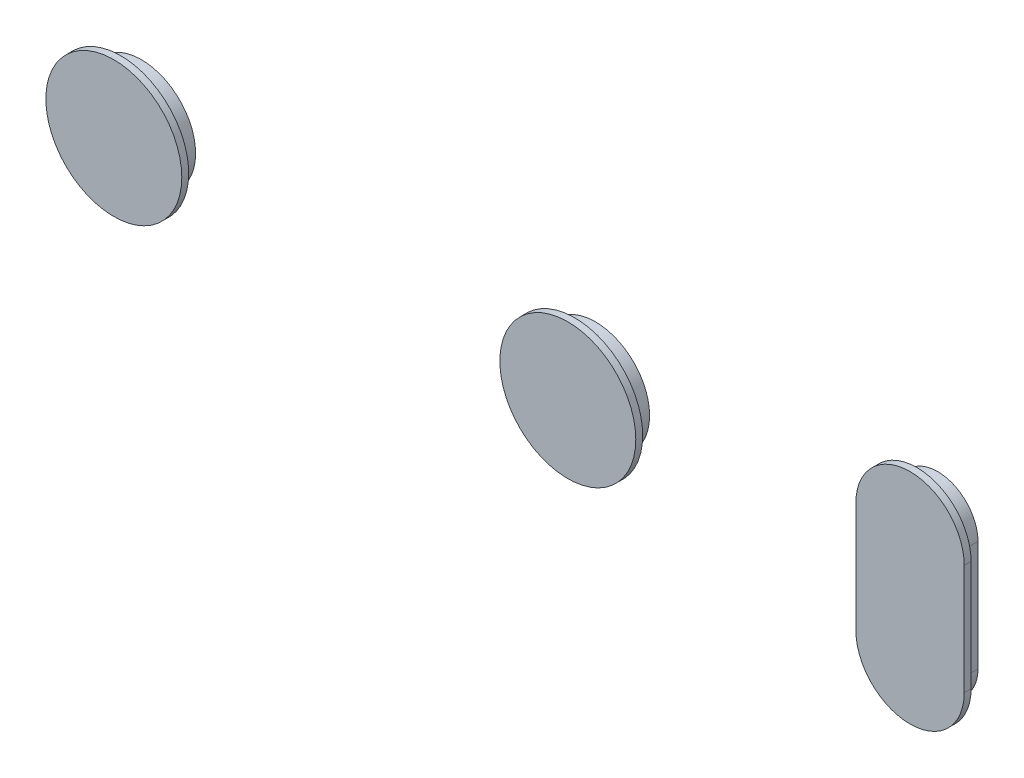
ISO-10303-21;
HEADER;
FILE_DESCRIPTION(('STEP AP214'),'2;1');
FILE_NAME('part.step','',(''),(''),'','','');
FILE_SCHEMA(('AUTOMOTIVE_DESIGN { 1 0 10303 214 1 1 1 1 }'));
ENDSEC;
DATA;
#1=APPLICATION_CONTEXT('core data for automotive mechanical design processes');
#2=APPLICATION_PROTOCOL_DEFINITION('international standard','automotive_design',2000,#1);
#3=PRODUCT_CONTEXT('',#1,'mechanical');
#4=PRODUCT('Part','Part','',(#3));
#5=PRODUCT_RELATED_PRODUCT_CATEGORY('part','',(#4));
#6=PRODUCT_DEFINITION_FORMATION('','',#4);
#7=PRODUCT_DEFINITION_CONTEXT('part definition',#1,'design');
#8=PRODUCT_DEFINITION('design','',#6,#7);
#9=PRODUCT_DEFINITION_SHAPE('','',#8);
#10=(LENGTH_UNIT() NAMED_UNIT(*) SI_UNIT(.MILLI.,.METRE.));
#11=(NAMED_UNIT(*) PLANE_ANGLE_UNIT() SI_UNIT($,.RADIAN.));
#12=(NAMED_UNIT(*) SI_UNIT($,.STERADIAN.) SOLID_ANGLE_UNIT());
#13=UNCERTAINTY_MEASURE_WITH_UNIT(LENGTH_MEASURE(1.E-05),#10,'distance_accuracy_value','');
#14=(GEOMETRIC_REPRESENTATION_CONTEXT(3) GLOBAL_UNCERTAINTY_ASSIGNED_CONTEXT((#13)) GLOBAL_UNIT_ASSIGNED_CONTEXT((#10,
#11,#12)) REPRESENTATION_CONTEXT('',''));
#15=CARTESIAN_POINT('',(0.,0.,0.));
#16=DIRECTION('',(0.,0.,1.));
#17=DIRECTION('',(1.,0.,0.));
#18=AXIS2_PLACEMENT_3D('',#15,#16,#17);
#19=CARTESIAN_POINT('',(313.691338582678,297.752755905512,-33.0695859632289));
#20=DIRECTION('',(0.,0.,1.));
#21=DIRECTION('',(1.,0.,0.));
#22=AXIS2_PLACEMENT_3D('',#19,#20,#21);
#23=CYLINDRICAL_SURFACE('',#22,5.85000000000002);
#24=CARTESIAN_POINT('',(313.691338582678,297.752755905512,-3.));
#25=DIRECTION('',(0.,0.,1.));
#26=DIRECTION('',(1.,0.,0.));
#27=AXIS2_PLACEMENT_3D('',#24,#25,#26);
#28=CIRCLE('',#27,5.85000000000002);
#29=CARTESIAN_POINT('',(307.841338582678,297.752755905512,-3.));
#30=VERTEX_POINT('',#29);
#31=CARTESIAN_POINT('',(319.541338582678,297.752755905512,-3.));
#32=VERTEX_POINT('',#31);
#33=EDGE_CURVE('E54',#30,#32,#28,.F.);
#34=ORIENTED_EDGE('',*,*,#33,.F.);
#35=DIRECTION('',(0.,0.,1.));
#36=VECTOR('',#35,1.);
#37=CARTESIAN_POINT('',(307.841338582678,297.752755905512,-33.0695859632289));
#38=LINE('',#37,#36);
#39=CARTESIAN_POINT('',(307.841338582678,297.752755905512,0.));
#40=VERTEX_POINT('',#39);
#41=EDGE_CURVE('E152',#30,#40,#38,.T.);
#42=ORIENTED_EDGE('',*,*,#41,.T.);
#43=CARTESIAN_POINT('',(313.691338582678,297.752755905512,0.));
#44=DIRECTION('',(0.,0.,1.));
#45=DIRECTION('',(1.,0.,0.));
#46=AXIS2_PLACEMENT_3D('',#43,#44,#45);
#47=CIRCLE('',#46,5.85000000000002);
#48=CARTESIAN_POINT('',(319.541338582678,297.752755905512,0.));
#49=VERTEX_POINT('',#48);
#50=EDGE_CURVE('E130',#49,#40,#47,.T.);
#51=ORIENTED_EDGE('',*,*,#50,.F.);
#52=DIRECTION('',(0.,0.,1.));
#53=VECTOR('',#52,1.);
#54=CARTESIAN_POINT('',(319.541338582678,297.752755905512,-33.0695859632289));
#55=LINE('',#54,#53);
#56=EDGE_CURVE('E141',#32,#49,#55,.T.);
#57=ORIENTED_EDGE('',*,*,#56,.F.);
#58=EDGE_LOOP('',(#34,#42,#51,#57));
#59=FACE_BOUND('',#58,.T.);
#60=ADVANCED_FACE('F46',(#59),#23,.T.);
#61=CARTESIAN_POINT('',(319.541338582677,281.752755905512,-33.0695859632289));
#62=DIRECTION('',(1.,0.,0.));
#63=DIRECTION('',(0.,1.,0.));
#64=AXIS2_PLACEMENT_3D('',#61,#62,#63);
#65=PLANE('',#64);
#66=DIRECTION('',(0.,-1.,0.));
#67=VECTOR('',#66,1.);
#68=CARTESIAN_POINT('',(319.541338582677,281.752755905512,-3.));
#69=LINE('',#68,#67);
#70=CARTESIAN_POINT('',(319.541338582677,281.752755905512,-3.));
#71=VERTEX_POINT('',#70);
#72=EDGE_CURVE('E60',#32,#71,#69,.T.);
#73=ORIENTED_EDGE('',*,*,#72,.F.);
#74=ORIENTED_EDGE('',*,*,#56,.T.);
#75=DIRECTION('',(0.,1.,0.));
#76=VECTOR('',#75,1.);
#77=CARTESIAN_POINT('',(319.541338582677,281.752755905512,0.));
#78=LINE('',#77,#76);
#79=CARTESIAN_POINT('',(319.541338582677,281.752755905512,0.));
#80=VERTEX_POINT('',#79);
#81=EDGE_CURVE('E149',#80,#49,#78,.T.);
#82=ORIENTED_EDGE('',*,*,#81,.F.);
#83=DIRECTION('',(0.,0.,1.));
#84=VECTOR('',#83,1.);
#85=CARTESIAN_POINT('',(319.541338582677,281.752755905512,-33.0695859632289));
#86=LINE('',#85,#84);
#87=EDGE_CURVE('E155',#71,#80,#86,.T.);
#88=ORIENTED_EDGE('',*,*,#87,.F.);
#89=EDGE_LOOP('',(#73,#74,#82,#88));
#90=FACE_BOUND('',#89,.T.);
#91=ADVANCED_FACE('F173',(#90),#65,.T.);
#92=CARTESIAN_POINT('',(313.691338582677,281.752755905512,-33.0695859632289));
#93=DIRECTION('',(0.,0.,1.));
#94=DIRECTION('',(1.,0.,0.));
#95=AXIS2_PLACEMENT_3D('',#92,#93,#94);
#96=CYLINDRICAL_SURFACE('',#95,5.85000000000002);
#97=CARTESIAN_POINT('',(313.691338582677,281.752755905512,-3.));
#98=DIRECTION('',(0.,0.,1.));
#99=DIRECTION('',(1.,0.,0.));
#100=AXIS2_PLACEMENT_3D('',#97,#98,#99);
#101=CIRCLE('',#100,5.85000000000002);
#102=CARTESIAN_POINT('',(307.841338582677,281.752755905512,-3.));
#103=VERTEX_POINT('',#102);
#104=EDGE_CURVE('E139',#71,#103,#101,.F.);
#105=ORIENTED_EDGE('',*,*,#104,.F.);
#106=ORIENTED_EDGE('',*,*,#87,.T.);
#107=CARTESIAN_POINT('',(313.691338582677,281.752755905512,0.));
#108=DIRECTION('',(0.,0.,1.));
#109=DIRECTION('',(1.,0.,0.));
#110=AXIS2_PLACEMENT_3D('',#107,#108,#109);
#111=CIRCLE('',#110,5.85000000000002);
#112=CARTESIAN_POINT('',(307.841338582677,281.752755905512,0.));
#113=VERTEX_POINT('',#112);
#114=EDGE_CURVE('E146',#113,#80,#111,.T.);
#115=ORIENTED_EDGE('',*,*,#114,.F.);
#116=DIRECTION('',(0.,0.,1.));
#117=VECTOR('',#116,1.);
#118=CARTESIAN_POINT('',(307.841338582677,281.752755905512,-33.0695859632289));
#119=LINE('',#118,#117);
#120=EDGE_CURVE('E157',#103,#113,#119,.T.);
#121=ORIENTED_EDGE('',*,*,#120,.F.);
#122=EDGE_LOOP('',(#105,#106,#115,#121));
#123=FACE_BOUND('',#122,.T.);
#124=ADVANCED_FACE('F175',(#123),#96,.T.);
#125=CARTESIAN_POINT('',(307.841338582678,297.752755905512,-33.0695859632289));
#126=DIRECTION('',(-1.,0.,0.));
#127=DIRECTION('',(0.,-1.,0.));
#128=AXIS2_PLACEMENT_3D('',#125,#126,#127);
#129=PLANE('',#128);
#130=DIRECTION('',(0.,1.,0.));
#131=VECTOR('',#130,1.);
#132=CARTESIAN_POINT('',(307.841338582678,297.752755905512,-3.));
#133=LINE('',#132,#131);
#134=EDGE_CURVE('E12',#103,#30,#133,.T.);
#135=ORIENTED_EDGE('',*,*,#134,.F.);
#136=ORIENTED_EDGE('',*,*,#120,.T.);
#137=DIRECTION('',(0.,-1.,0.));
#138=VECTOR('',#137,1.);
#139=CARTESIAN_POINT('',(307.841338582678,297.752755905512,0.));
#140=LINE('',#139,#138);
#141=EDGE_CURVE('E133',#40,#113,#140,.T.);
#142=ORIENTED_EDGE('',*,*,#141,.F.);
#143=ORIENTED_EDGE('',*,*,#41,.F.);
#144=EDGE_LOOP('',(#135,#136,#142,#143));
#145=FACE_BOUND('',#144,.T.);
#146=ADVANCED_FACE('F165',(#145),#129,.T.);
#147=CARTESIAN_POINT('',(43.6913385826773,289.752755905512,-3.));
#148=DIRECTION('',(0.,0.,1.));
#149=DIRECTION('',(1.,0.,0.));
#150=AXIS2_PLACEMENT_3D('',#147,#148,#149);
#151=PLANE('',#150);
#152=ORIENTED_EDGE('',*,*,#33,.T.);
#153=ORIENTED_EDGE('',*,*,#72,.T.);
#154=ORIENTED_EDGE('',*,*,#104,.T.);
#155=ORIENTED_EDGE('',*,*,#134,.T.);
#156=EDGE_LOOP('',(#152,#153,#154,#155));
#157=FACE_BOUND('',#156,.T.);
#158=ADVANCED_FACE('F176',(#157),#151,.F.);
#159=CARTESIAN_POINT('',(313.691338582678,297.752755905512,0.));
#160=DIRECTION('',(0.,0.,1.));
#161=DIRECTION('',(1.,0.,0.));
#162=AXIS2_PLACEMENT_3D('',#159,#160,#161);
#163=PLANE('',#162);
#164=CARTESIAN_POINT('',(313.691338582678,297.752755905512,0.));
#165=DIRECTION('',(0.,0.,1.));
#166=DIRECTION('',(1.,0.,0.));
#167=AXIS2_PLACEMENT_3D('',#164,#165,#166);
#168=CIRCLE('',#167,7.85000000000002);
#169=CARTESIAN_POINT('',(321.541338582678,297.752755905512,0.));
#170=VERTEX_POINT('',#169);
#171=CARTESIAN_POINT('',(305.841338582678,297.752755905512,0.));
#172=VERTEX_POINT('',#171);
#173=EDGE_CURVE('E129',#170,#172,#168,.T.);
#174=ORIENTED_EDGE('',*,*,#173,.F.);
#175=DIRECTION('',(0.,1.,0.));
#176=VECTOR('',#175,1.);
#177=CARTESIAN_POINT('',(321.541338582677,281.752755905512,0.));
#178=LINE('',#177,#176);
#179=CARTESIAN_POINT('',(321.541338582677,281.752755905512,0.));
#180=VERTEX_POINT('',#179);
#181=EDGE_CURVE('E125',#180,#170,#178,.T.);
#182=ORIENTED_EDGE('',*,*,#181,.F.);
#183=CARTESIAN_POINT('',(313.691338582677,281.752755905512,0.));
#184=DIRECTION('',(0.,0.,1.));
#185=DIRECTION('',(1.,0.,0.));
#186=AXIS2_PLACEMENT_3D('',#183,#184,#185);
#187=CIRCLE('',#186,7.85000000000002);
#188=CARTESIAN_POINT('',(305.841338582677,281.752755905512,0.));
#189=VERTEX_POINT('',#188);
#190=EDGE_CURVE('E260',#189,#180,#187,.T.);
#191=ORIENTED_EDGE('',*,*,#190,.F.);
#192=DIRECTION('',(0.,-1.,0.));
#193=VECTOR('',#192,1.);
#194=CARTESIAN_POINT('',(305.841338582678,297.752755905512,0.));
#195=LINE('',#194,#193);
#196=EDGE_CURVE('E263',#172,#189,#195,.T.);
#197=ORIENTED_EDGE('',*,*,#196,.F.);
#198=EDGE_LOOP('',(#174,#182,#191,#197));
#199=FACE_BOUND('',#198,.T.);
#200=ORIENTED_EDGE('',*,*,#81,.T.);
#201=ORIENTED_EDGE('',*,*,#50,.T.);
#202=ORIENTED_EDGE('',*,*,#141,.T.);
#203=ORIENTED_EDGE('',*,*,#114,.T.);
#204=EDGE_LOOP('',(#200,#201,#202,#203));
#205=FACE_BOUND('',#204,.T.);
#206=ADVANCED_FACE('F169',(#199,#205),#163,.F.);
#207=CARTESIAN_POINT('',(313.691338582678,297.752755905512,1.));
#208=DIRECTION('',(0.,0.,-1.));
#209=DIRECTION('',(-1.,0.,0.));
#210=AXIS2_PLACEMENT_3D('',#207,#208,#209);
#211=CYLINDRICAL_SURFACE('',#210,7.85000000000002);
#212=ORIENTED_EDGE('',*,*,#173,.T.);
#213=DIRECTION('',(0.,0.,-1.));
#214=VECTOR('',#213,1.);
#215=CARTESIAN_POINT('',(305.841338582678,297.752755905512,1.));
#216=LINE('',#215,#214);
#217=CARTESIAN_POINT('',(305.841338582678,297.752755905512,1.));
#218=VERTEX_POINT('',#217);
#219=EDGE_CURVE('E109',#218,#172,#216,.T.);
#220=ORIENTED_EDGE('',*,*,#219,.F.);
#221=CARTESIAN_POINT('',(313.691338582678,297.752755905512,1.));
#222=DIRECTION('',(0.,0.,1.));
#223=DIRECTION('',(1.,0.,0.));
#224=AXIS2_PLACEMENT_3D('',#221,#222,#223);
#225=CIRCLE('',#224,7.85000000000002);
#226=CARTESIAN_POINT('',(321.541338582678,297.752755905512,1.));
#227=VERTEX_POINT('',#226);
#228=EDGE_CURVE('E116',#227,#218,#225,.T.);
#229=ORIENTED_EDGE('',*,*,#228,.F.);
#230=DIRECTION('',(0.,0.,-1.));
#231=VECTOR('',#230,1.);
#232=CARTESIAN_POINT('',(321.541338582678,297.752755905512,1.));
#233=LINE('',#232,#231);
#234=EDGE_CURVE('E257',#227,#170,#233,.T.);
#235=ORIENTED_EDGE('',*,*,#234,.T.);
#236=EDGE_LOOP('',(#212,#220,#229,#235));
#237=FACE_BOUND('',#236,.T.);
#238=ADVANCED_FACE('F127',(#237),#211,.T.);
#239=CARTESIAN_POINT('',(305.841338582678,297.752755905512,1.));
#240=DIRECTION('',(1.,0.,0.));
#241=DIRECTION('',(0.,1.,0.));
#242=AXIS2_PLACEMENT_3D('',#239,#240,#241);
#243=PLANE('',#242);
#244=ORIENTED_EDGE('',*,*,#196,.T.);
#245=DIRECTION('',(0.,0.,-1.));
#246=VECTOR('',#245,1.);
#247=CARTESIAN_POINT('',(305.841338582677,281.752755905512,1.));
#248=LINE('',#247,#246);
#249=CARTESIAN_POINT('',(305.841338582677,281.752755905512,1.));
#250=VERTEX_POINT('',#249);
#251=EDGE_CURVE('E112',#250,#189,#248,.T.);
#252=ORIENTED_EDGE('',*,*,#251,.F.);
#253=DIRECTION('',(0.,-1.,0.));
#254=VECTOR('',#253,1.);
#255=CARTESIAN_POINT('',(305.841338582678,297.752755905512,1.));
#256=LINE('',#255,#254);
#257=EDGE_CURVE('E105',#218,#250,#256,.T.);
#258=ORIENTED_EDGE('',*,*,#257,.F.);
#259=ORIENTED_EDGE('',*,*,#219,.T.);
#260=EDGE_LOOP('',(#244,#252,#258,#259));
#261=FACE_BOUND('',#260,.T.);
#262=ADVANCED_FACE('F107',(#261),#243,.F.);
#263=CARTESIAN_POINT('',(313.691338582677,281.752755905512,1.));
#264=DIRECTION('',(0.,0.,-1.));
#265=DIRECTION('',(-1.,0.,0.));
#266=AXIS2_PLACEMENT_3D('',#263,#264,#265);
#267=CYLINDRICAL_SURFACE('',#266,7.85000000000002);
#268=ORIENTED_EDGE('',*,*,#190,.T.);
#269=DIRECTION('',(0.,0.,-1.));
#270=VECTOR('',#269,1.);
#271=CARTESIAN_POINT('',(321.541338582677,281.752755905512,1.));
#272=LINE('',#271,#270);
#273=CARTESIAN_POINT('',(321.541338582677,281.752755905512,1.));
#274=VERTEX_POINT('',#273);
#275=EDGE_CURVE('E135',#274,#180,#272,.T.);
#276=ORIENTED_EDGE('',*,*,#275,.F.);
#277=CARTESIAN_POINT('',(313.691338582677,281.752755905512,1.));
#278=DIRECTION('',(0.,0.,1.));
#279=DIRECTION('',(1.,0.,0.));
#280=AXIS2_PLACEMENT_3D('',#277,#278,#279);
#281=CIRCLE('',#280,7.85000000000002);
#282=EDGE_CURVE('E115',#250,#274,#281,.T.);
#283=ORIENTED_EDGE('',*,*,#282,.F.);
#284=ORIENTED_EDGE('',*,*,#251,.T.);
#285=EDGE_LOOP('',(#268,#276,#283,#284));
#286=FACE_BOUND('',#285,.T.);
#287=ADVANCED_FACE('F224',(#286),#267,.T.);
#288=CARTESIAN_POINT('',(321.541338582677,281.752755905512,1.));
#289=DIRECTION('',(-1.,0.,0.));
#290=DIRECTION('',(0.,-1.,0.));
#291=AXIS2_PLACEMENT_3D('',#288,#289,#290);
#292=PLANE('',#291);
#293=ORIENTED_EDGE('',*,*,#181,.T.);
#294=ORIENTED_EDGE('',*,*,#234,.F.);
#295=DIRECTION('',(0.,1.,0.));
#296=VECTOR('',#295,1.);
#297=CARTESIAN_POINT('',(321.541338582677,281.752755905512,1.));
#298=LINE('',#297,#296);
#299=EDGE_CURVE('E121',#274,#227,#298,.T.);
#300=ORIENTED_EDGE('',*,*,#299,.F.);
#301=ORIENTED_EDGE('',*,*,#275,.T.);
#302=EDGE_LOOP('',(#293,#294,#300,#301));
#303=FACE_BOUND('',#302,.T.);
#304=ADVANCED_FACE('F233',(#303),#292,.F.);
#305=CARTESIAN_POINT('',(313.691338582678,297.752755905512,1.));
#306=DIRECTION('',(0.,0.,1.));
#307=DIRECTION('',(1.,0.,0.));
#308=AXIS2_PLACEMENT_3D('',#305,#306,#307);
#309=PLANE('',#308);
#310=ORIENTED_EDGE('',*,*,#228,.T.);
#311=ORIENTED_EDGE('',*,*,#257,.T.);
#312=ORIENTED_EDGE('',*,*,#282,.T.);
#313=ORIENTED_EDGE('',*,*,#299,.T.);
#314=EDGE_LOOP('',(#310,#311,#312,#313));
#315=FACE_BOUND('',#314,.T.);
#316=ADVANCED_FACE('F119',(#315),#309,.T.);
#317=CLOSED_SHELL('',(#60,#91,#124,#146,#158,#206,#238,#262,#287,#304,#316));
#318=MANIFOLD_SOLID_BREP('B2',#317);
#319=CARTESIAN_POINT('',(264.091338582678,289.752755905512,-33.0695859632289));
#320=DIRECTION('',(0.,0.,1.));
#321=DIRECTION('',(1.,0.,0.));
#322=AXIS2_PLACEMENT_3D('',#319,#320,#321);
#323=CYLINDRICAL_SURFACE('',#322,7.84999999999997);
#324=CARTESIAN_POINT('',(264.091338582678,289.752755905512,-3.));
#325=DIRECTION('',(0.,0.,1.));
#326=DIRECTION('',(1.,0.,0.));
#327=AXIS2_PLACEMENT_3D('',#324,#325,#326);
#328=CIRCLE('',#327,7.84999999999997);
#329=CARTESIAN_POINT('',(271.941338582677,289.752755905512,-3.));
#330=VERTEX_POINT('',#329);
#331=EDGE_CURVE('E45',#330,#330,#328,.F.);
#332=ORIENTED_EDGE('',*,*,#331,.F.);
#333=EDGE_LOOP('',(#332));
#334=FACE_BOUND('',#333,.T.);
#335=CARTESIAN_POINT('',(264.091338582678,289.752755905512,0.));
#336=DIRECTION('',(0.,0.,1.));
#337=DIRECTION('',(1.,0.,0.));
#338=AXIS2_PLACEMENT_3D('',#335,#336,#337);
#339=CIRCLE('',#338,7.84999999999997);
#340=CARTESIAN_POINT('',(271.941338582677,289.752755905512,0.));
#341=VERTEX_POINT('',#340);
#342=EDGE_CURVE('E299',#341,#341,#339,.T.);
#343=ORIENTED_EDGE('',*,*,#342,.F.);
#344=EDGE_LOOP('',(#343));
#345=FACE_BOUND('',#344,.T.);
#346=ADVANCED_FACE('F292',(#334,#345),#323,.T.);
#347=CARTESIAN_POINT('',(43.6913385826773,289.752755905512,-3.));
#348=DIRECTION('',(0.,0.,1.));
#349=DIRECTION('',(1.,0.,0.));
#350=AXIS2_PLACEMENT_3D('',#347,#348,#349);
#351=PLANE('',#350);
#352=ORIENTED_EDGE('',*,*,#331,.T.);
#353=EDGE_LOOP('',(#352));
#354=FACE_BOUND('',#353,.T.);
#355=ADVANCED_FACE('F329',(#354),#351,.F.);
#356=CARTESIAN_POINT('',(264.091338582678,289.752755905512,1.));
#357=DIRECTION('',(0.,0.,-1.));
#358=DIRECTION('',(-1.,0.,0.));
#359=AXIS2_PLACEMENT_3D('',#356,#357,#358);
#360=CYLINDRICAL_SURFACE('',#359,9.84999999999996);
#361=CARTESIAN_POINT('',(264.091338582678,289.752755905512,1.));
#362=DIRECTION('',(0.,0.,1.));
#363=DIRECTION('',(1.,0.,0.));
#364=AXIS2_PLACEMENT_3D('',#361,#362,#363);
#365=CIRCLE('',#364,9.84999999999996);
#366=CARTESIAN_POINT('',(273.941338582677,289.752755905512,1.));
#367=VERTEX_POINT('',#366);
#368=EDGE_CURVE('E305',#367,#367,#365,.T.);
#369=ORIENTED_EDGE('',*,*,#368,.F.);
#370=EDGE_LOOP('',(#369));
#371=FACE_BOUND('',#370,.T.);
#372=CARTESIAN_POINT('',(264.091338582678,289.752755905512,0.));
#373=DIRECTION('',(0.,0.,1.));
#374=DIRECTION('',(1.,0.,0.));
#375=AXIS2_PLACEMENT_3D('',#372,#373,#374);
#376=CIRCLE('',#375,9.84999999999996);
#377=CARTESIAN_POINT('',(273.941338582677,289.752755905512,0.));
#378=VERTEX_POINT('',#377);
#379=EDGE_CURVE('E310',#378,#378,#376,.T.);
#380=ORIENTED_EDGE('',*,*,#379,.T.);
#381=EDGE_LOOP('',(#380));
#382=FACE_BOUND('',#381,.T.);
#383=ADVANCED_FACE('F316',(#371,#382),#360,.T.);
#384=CARTESIAN_POINT('',(264.091338582678,289.752755905512,1.));
#385=DIRECTION('',(0.,0.,1.));
#386=DIRECTION('',(1.,0.,0.));
#387=AXIS2_PLACEMENT_3D('',#384,#385,#386);
#388=PLANE('',#387);
#389=ORIENTED_EDGE('',*,*,#368,.T.);
#390=EDGE_LOOP('',(#389));
#391=FACE_BOUND('',#390,.T.);
#392=ADVANCED_FACE('F320',(#391),#388,.T.);
#393=CARTESIAN_POINT('',(264.091338582678,289.752755905512,0.));
#394=DIRECTION('',(0.,0.,1.));
#395=DIRECTION('',(1.,0.,0.));
#396=AXIS2_PLACEMENT_3D('',#393,#394,#395);
#397=PLANE('',#396);
#398=ORIENTED_EDGE('',*,*,#342,.T.);
#399=EDGE_LOOP('',(#398));
#400=FACE_BOUND('',#399,.T.);
#401=ORIENTED_EDGE('',*,*,#379,.F.);
#402=EDGE_LOOP('',(#401));
#403=FACE_BOUND('',#402,.T.);
#404=ADVANCED_FACE('F318',(#400,#403),#397,.F.);
#405=CLOSED_SHELL('',(#346,#355,#383,#392,#404));
#406=MANIFOLD_SOLID_BREP('B6',#405);
#407=CARTESIAN_POINT('',(198.291338582678,289.752755905512,-33.0695859632289));
#408=DIRECTION('',(0.,0.,1.));
#409=DIRECTION('',(1.,0.,0.));
#410=AXIS2_PLACEMENT_3D('',#407,#408,#409);
#411=CYLINDRICAL_SURFACE('',#410,7.85000000000002);
#412=CARTESIAN_POINT('',(198.291338582678,289.752755905512,-3.));
#413=DIRECTION('',(0.,0.,1.));
#414=DIRECTION('',(1.,0.,0.));
#415=AXIS2_PLACEMENT_3D('',#412,#413,#414);
#416=CIRCLE('',#415,7.85000000000002);
#417=CARTESIAN_POINT('',(206.141338582678,289.752755905512,-3.));
#418=VERTEX_POINT('',#417);
#419=EDGE_CURVE('E291',#418,#418,#416,.F.);
#420=ORIENTED_EDGE('',*,*,#419,.F.);
#421=EDGE_LOOP('',(#420));
#422=FACE_BOUND('',#421,.T.);
#423=CARTESIAN_POINT('',(198.291338582678,289.752755905512,0.));
#424=DIRECTION('',(0.,0.,1.));
#425=DIRECTION('',(1.,0.,0.));
#426=AXIS2_PLACEMENT_3D('',#423,#424,#425);
#427=CIRCLE('',#426,7.85000000000002);
#428=CARTESIAN_POINT('',(206.141338582678,289.752755905512,0.));
#429=VERTEX_POINT('',#428);
#430=EDGE_CURVE('E377',#429,#429,#427,.T.);
#431=ORIENTED_EDGE('',*,*,#430,.F.);
#432=EDGE_LOOP('',(#431));
#433=FACE_BOUND('',#432,.T.);
#434=ADVANCED_FACE('F371',(#422,#433),#411,.T.);
#435=CARTESIAN_POINT('',(43.6913385826773,289.752755905512,-3.));
#436=DIRECTION('',(0.,0.,1.));
#437=DIRECTION('',(1.,0.,0.));
#438=AXIS2_PLACEMENT_3D('',#435,#436,#437);
#439=PLANE('',#438);
#440=ORIENTED_EDGE('',*,*,#419,.T.);
#441=EDGE_LOOP('',(#440));
#442=FACE_BOUND('',#441,.T.);
#443=ADVANCED_FACE('F404',(#442),#439,.F.);
#444=CARTESIAN_POINT('',(198.291338582678,289.752755905512,1.));
#445=DIRECTION('',(0.,0.,-1.));
#446=DIRECTION('',(-1.,0.,0.));
#447=AXIS2_PLACEMENT_3D('',#444,#445,#446);
#448=CYLINDRICAL_SURFACE('',#447,9.85000000000002);
#449=CARTESIAN_POINT('',(198.291338582678,289.752755905512,1.));
#450=DIRECTION('',(0.,0.,1.));
#451=DIRECTION('',(1.,0.,0.));
#452=AXIS2_PLACEMENT_3D('',#449,#450,#451);
#453=CIRCLE('',#452,9.85000000000002);
#454=CARTESIAN_POINT('',(208.141338582678,289.752755905512,1.));
#455=VERTEX_POINT('',#454);
#456=EDGE_CURVE('E381',#455,#455,#453,.T.);
#457=ORIENTED_EDGE('',*,*,#456,.F.);
#458=EDGE_LOOP('',(#457));
#459=FACE_BOUND('',#458,.T.);
#460=CARTESIAN_POINT('',(198.291338582678,289.752755905512,0.));
#461=DIRECTION('',(0.,0.,1.));
#462=DIRECTION('',(1.,0.,0.));
#463=AXIS2_PLACEMENT_3D('',#460,#461,#462);
#464=CIRCLE('',#463,9.85000000000002);
#465=CARTESIAN_POINT('',(208.141338582678,289.752755905512,0.));
#466=VERTEX_POINT('',#465);
#467=EDGE_CURVE('E385',#466,#466,#464,.T.);
#468=ORIENTED_EDGE('',*,*,#467,.T.);
#469=EDGE_LOOP('',(#468));
#470=FACE_BOUND('',#469,.T.);
#471=ADVANCED_FACE('F391',(#459,#470),#448,.T.);
#472=CARTESIAN_POINT('',(198.291338582678,289.752755905512,1.));
#473=DIRECTION('',(0.,0.,1.));
#474=DIRECTION('',(1.,0.,0.));
#475=AXIS2_PLACEMENT_3D('',#472,#473,#474);
#476=PLANE('',#475);
#477=ORIENTED_EDGE('',*,*,#456,.T.);
#478=EDGE_LOOP('',(#477));
#479=FACE_BOUND('',#478,.T.);
#480=ADVANCED_FACE('F395',(#479),#476,.T.);
#481=CARTESIAN_POINT('',(198.291338582678,289.752755905512,0.));
#482=DIRECTION('',(0.,0.,1.));
#483=DIRECTION('',(1.,0.,0.));
#484=AXIS2_PLACEMENT_3D('',#481,#482,#483);
#485=PLANE('',#484);
#486=ORIENTED_EDGE('',*,*,#430,.T.);
#487=EDGE_LOOP('',(#486));
#488=FACE_BOUND('',#487,.T.);
#489=ORIENTED_EDGE('',*,*,#467,.F.);
#490=EDGE_LOOP('',(#489));
#491=FACE_BOUND('',#490,.T.);
#492=ADVANCED_FACE('F393',(#488,#491),#485,.F.);
#493=CLOSED_SHELL('',(#434,#443,#471,#480,#492));
#494=MANIFOLD_SOLID_BREP('B40',#493);
#495=ADVANCED_BREP_SHAPE_REPRESENTATION('',(#18,#318,#406,#494),#14);
#496=SHAPE_DEFINITION_REPRESENTATION(#9,#495);
ENDSEC;
END-ISO-10303-21;
